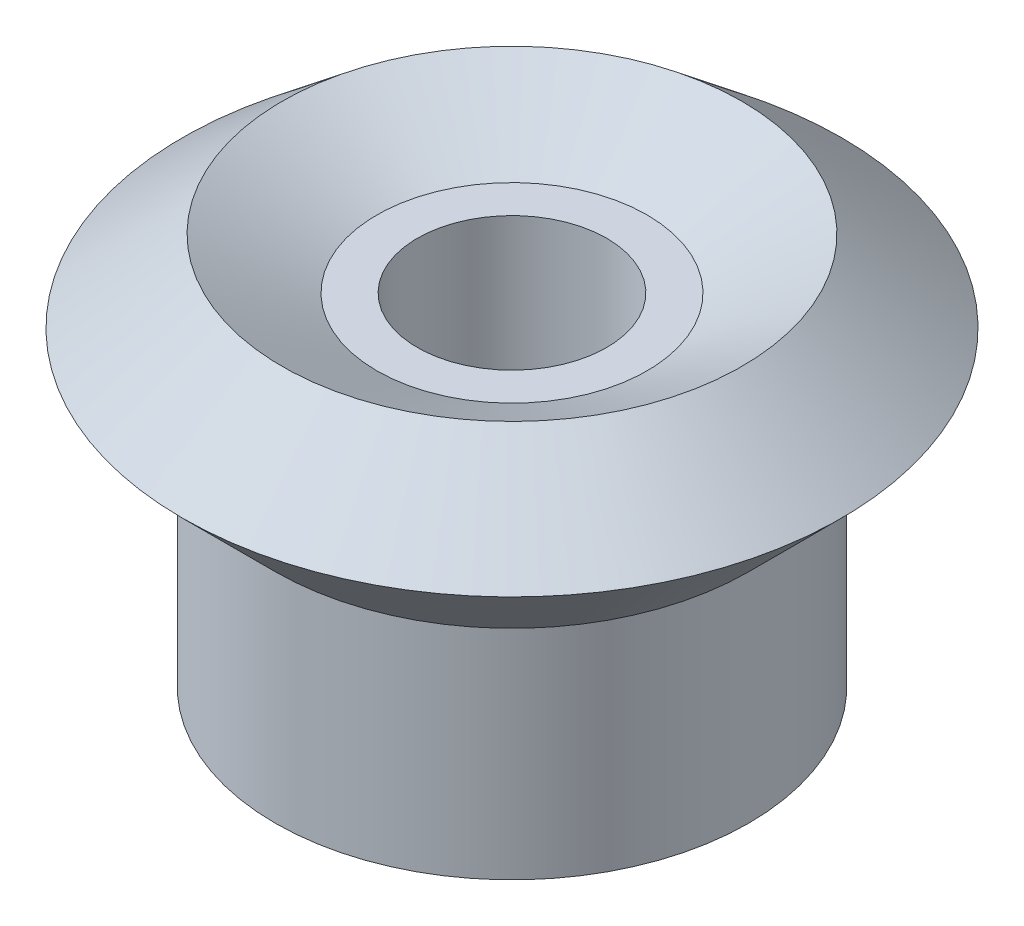
ISO-10303-21;
HEADER;
FILE_DESCRIPTION(('STEP AP214'),'2;1');
FILE_NAME('part.step','',(''),(''),'','','');
FILE_SCHEMA(('AUTOMOTIVE_DESIGN { 1 0 10303 214 1 1 1 1 }'));
ENDSEC;
DATA;
#1=APPLICATION_CONTEXT('core data for automotive mechanical design processes');
#2=APPLICATION_PROTOCOL_DEFINITION('international standard','automotive_design',2000,#1);
#3=PRODUCT_CONTEXT('',#1,'mechanical');
#4=PRODUCT('Part','Part','',(#3));
#5=PRODUCT_RELATED_PRODUCT_CATEGORY('part','',(#4));
#6=PRODUCT_DEFINITION_FORMATION('','',#4);
#7=PRODUCT_DEFINITION_CONTEXT('part definition',#1,'design');
#8=PRODUCT_DEFINITION('design','',#6,#7);
#9=PRODUCT_DEFINITION_SHAPE('','',#8);
#10=(LENGTH_UNIT() NAMED_UNIT(*) SI_UNIT(.MILLI.,.METRE.));
#11=(NAMED_UNIT(*) PLANE_ANGLE_UNIT() SI_UNIT($,.RADIAN.));
#12=(NAMED_UNIT(*) SI_UNIT($,.STERADIAN.) SOLID_ANGLE_UNIT());
#13=UNCERTAINTY_MEASURE_WITH_UNIT(LENGTH_MEASURE(1.E-05),#10,'distance_accuracy_value','');
#14=(GEOMETRIC_REPRESENTATION_CONTEXT(3) GLOBAL_UNCERTAINTY_ASSIGNED_CONTEXT((#13)) GLOBAL_UNIT_ASSIGNED_CONTEXT((#10,
#11,#12)) REPRESENTATION_CONTEXT('',''));
#15=CARTESIAN_POINT('',(0.,0.,0.));
#16=DIRECTION('',(0.,0.,1.));
#17=DIRECTION('',(1.,0.,0.));
#18=AXIS2_PLACEMENT_3D('',#15,#16,#17);
#19=CARTESIAN_POINT('',(0.,11.4999999999875,0.));
#20=DIRECTION('',(0.,1.,0.));
#21=DIRECTION('',(0.,0.,1.));
#22=AXIS2_PLACEMENT_3D('',#19,#20,#21);
#23=CONICAL_SURFACE('',#22,12.5000000000125,0.785398163397448);
#24=CARTESIAN_POINT('',(0.,16.3999999999875,0.));
#25=DIRECTION('',(0.,-1.,0.));
#26=DIRECTION('',(0.,0.,-1.));
#27=AXIS2_PLACEMENT_3D('',#24,#25,#26);
#28=CIRCLE('',#27,17.4000000000125);
#29=CARTESIAN_POINT('',(0.,16.3999999999875,-17.4000000000125));
#30=VERTEX_POINT('',#29);
#31=EDGE_CURVE('E10',#30,#30,#28,.T.);
#32=ORIENTED_EDGE('',*,*,#31,.T.);
#33=EDGE_LOOP('',(#32));
#34=FACE_BOUND('',#33,.T.);
#35=CARTESIAN_POINT('',(0.,11.4999999999875,0.));
#36=DIRECTION('',(0.,-1.,0.));
#37=DIRECTION('',(0.,0.,-1.));
#38=AXIS2_PLACEMENT_3D('',#35,#36,#37);
#39=CIRCLE('',#38,12.5000000000125);
#40=CARTESIAN_POINT('',(0.,11.4999999999875,-12.5000000000125));
#41=VERTEX_POINT('',#40);
#42=EDGE_CURVE('E57',#41,#41,#39,.T.);
#43=ORIENTED_EDGE('',*,*,#42,.F.);
#44=EDGE_LOOP('',(#43));
#45=FACE_BOUND('',#44,.T.);
#46=ADVANCED_FACE('F32',(#34,#45),#23,.T.);
#47=CARTESIAN_POINT('',(0.,16.3999999999875,0.));
#48=DIRECTION('',(0.,-1.,0.));
#49=DIRECTION('',(0.,0.,-1.));
#50=AXIS2_PLACEMENT_3D('',#47,#48,#49);
#51=CONICAL_SURFACE('',#50,17.4000000000125,0.886209572399739);
#52=CARTESIAN_POINT('',(0.,20.6999999997426,0.));
#53=DIRECTION('',(0.,-1.,0.));
#54=DIRECTION('',(0.,0.,-1.));
#55=AXIS2_PLACEMENT_3D('',#52,#53,#54);
#56=CIRCLE('',#55,12.1321729997899);
#57=CARTESIAN_POINT('',(0.,20.6999999997426,-12.1321729997899));
#58=VERTEX_POINT('',#57);
#59=EDGE_CURVE('E38',#58,#58,#56,.T.);
#60=ORIENTED_EDGE('',*,*,#59,.T.);
#61=EDGE_LOOP('',(#60));
#62=FACE_BOUND('',#61,.T.);
#63=ORIENTED_EDGE('',*,*,#31,.F.);
#64=EDGE_LOOP('',(#63));
#65=FACE_BOUND('',#64,.T.);
#66=ADVANCED_FACE('F65',(#62,#65),#51,.T.);
#67=CARTESIAN_POINT('',(0.,20.6999999997426,0.));
#68=DIRECTION('',(0.,1.,0.));
#69=DIRECTION('',(0.,0.,1.));
#70=AXIS2_PLACEMENT_3D('',#67,#68,#69);
#71=CONICAL_SURFACE('',#70,12.1321729997899,1.0756630633428);
#72=CARTESIAN_POINT('',(0.,18.,0.));
#73=DIRECTION('',(0.,-1.,0.));
#74=DIRECTION('',(0.,0.,-1.));
#75=AXIS2_PLACEMENT_3D('',#72,#73,#74);
#76=CIRCLE('',#75,7.13217300007154);
#77=CARTESIAN_POINT('',(0.,18.,-7.13217300007154));
#78=VERTEX_POINT('',#77);
#79=EDGE_CURVE('E42',#78,#78,#76,.T.);
#80=ORIENTED_EDGE('',*,*,#79,.T.);
#81=EDGE_LOOP('',(#80));
#82=FACE_BOUND('',#81,.T.);
#83=ORIENTED_EDGE('',*,*,#59,.F.);
#84=EDGE_LOOP('',(#83));
#85=FACE_BOUND('',#84,.T.);
#86=ADVANCED_FACE('F69',(#82,#85),#71,.F.);
#87=CARTESIAN_POINT('',(7.13217300007154,18.,0.));
#88=DIRECTION('',(0.,1.,0.));
#89=DIRECTION('',(0.,0.,1.));
#90=AXIS2_PLACEMENT_3D('',#87,#88,#89);
#91=PLANE('',#90);
#92=CARTESIAN_POINT('',(0.,18.,0.));
#93=DIRECTION('',(0.,-1.,0.));
#94=DIRECTION('',(0.,0.,-1.));
#95=AXIS2_PLACEMENT_3D('',#92,#93,#94);
#96=CIRCLE('',#95,5.);
#97=CARTESIAN_POINT('',(0.,18.,-5.));
#98=VERTEX_POINT('',#97);
#99=EDGE_CURVE('E46',#98,#98,#96,.T.);
#100=ORIENTED_EDGE('',*,*,#99,.T.);
#101=EDGE_LOOP('',(#100));
#102=FACE_BOUND('',#101,.T.);
#103=ORIENTED_EDGE('',*,*,#79,.F.);
#104=EDGE_LOOP('',(#103));
#105=FACE_BOUND('',#104,.T.);
#106=ADVANCED_FACE('F73',(#102,#105),#91,.T.);
#107=CARTESIAN_POINT('',(0.,20.6999999997426,0.));
#108=DIRECTION('',(0.,-1.,0.));
#109=DIRECTION('',(0.,0.,-1.));
#110=AXIS2_PLACEMENT_3D('',#107,#108,#109);
#111=CYLINDRICAL_SURFACE('',#110,5.);
#112=CARTESIAN_POINT('',(0.,0.,0.));
#113=DIRECTION('',(0.,-1.,0.));
#114=DIRECTION('',(0.,0.,-1.));
#115=AXIS2_PLACEMENT_3D('',#112,#113,#114);
#116=CIRCLE('',#115,5.);
#117=CARTESIAN_POINT('',(0.,0.,-5.));
#118=VERTEX_POINT('',#117);
#119=EDGE_CURVE('E51',#118,#118,#116,.T.);
#120=ORIENTED_EDGE('',*,*,#119,.T.);
#121=EDGE_LOOP('',(#120));
#122=FACE_BOUND('',#121,.T.);
#123=ORIENTED_EDGE('',*,*,#99,.F.);
#124=EDGE_LOOP('',(#123));
#125=FACE_BOUND('',#124,.T.);
#126=ADVANCED_FACE('F80',(#122,#125),#111,.F.);
#127=CARTESIAN_POINT('',(5.,0.,0.));
#128=DIRECTION('',(0.,-1.,0.));
#129=DIRECTION('',(0.,0.,-1.));
#130=AXIS2_PLACEMENT_3D('',#127,#128,#129);
#131=PLANE('',#130);
#132=CARTESIAN_POINT('',(0.,0.,0.));
#133=DIRECTION('',(0.,-1.,0.));
#134=DIRECTION('',(0.,0.,-1.));
#135=AXIS2_PLACEMENT_3D('',#132,#133,#134);
#136=CIRCLE('',#135,12.5000000000125);
#137=CARTESIAN_POINT('',(0.,0.,-12.5000000000125));
#138=VERTEX_POINT('',#137);
#139=EDGE_CURVE('E54',#138,#138,#136,.T.);
#140=ORIENTED_EDGE('',*,*,#139,.T.);
#141=EDGE_LOOP('',(#140));
#142=FACE_BOUND('',#141,.T.);
#143=ORIENTED_EDGE('',*,*,#119,.F.);
#144=EDGE_LOOP('',(#143));
#145=FACE_BOUND('',#144,.T.);
#146=ADVANCED_FACE('F84',(#142,#145),#131,.T.);
#147=CARTESIAN_POINT('',(0.,20.6999999997426,0.));
#148=DIRECTION('',(0.,-1.,0.));
#149=DIRECTION('',(0.,0.,-1.));
#150=AXIS2_PLACEMENT_3D('',#147,#148,#149);
#151=CYLINDRICAL_SURFACE('',#150,12.5000000000125);
#152=ORIENTED_EDGE('',*,*,#42,.T.);
#153=EDGE_LOOP('',(#152));
#154=FACE_BOUND('',#153,.T.);
#155=ORIENTED_EDGE('',*,*,#139,.F.);
#156=EDGE_LOOP('',(#155));
#157=FACE_BOUND('',#156,.T.);
#158=ADVANCED_FACE('F61',(#154,#157),#151,.T.);
#159=CLOSED_SHELL('',(#46,#66,#86,#106,#126,#146,#158));
#160=MANIFOLD_SOLID_BREP('B2',#159);
#161=ADVANCED_BREP_SHAPE_REPRESENTATION('',(#18,#160),#14);
#162=SHAPE_DEFINITION_REPRESENTATION(#9,#161);
ENDSEC;
END-ISO-10303-21;
